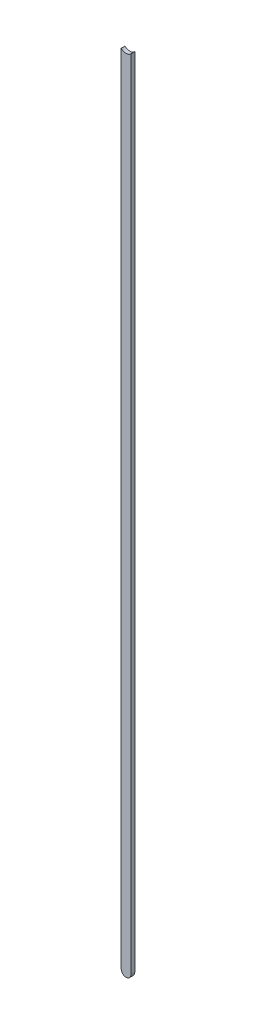
ISO-10303-21;
HEADER;
FILE_DESCRIPTION(('STEP AP214'),'2;1');
FILE_NAME('part.step','',(''),(''),'','','');
FILE_SCHEMA(('AUTOMOTIVE_DESIGN { 1 0 10303 214 1 1 1 1 }'));
ENDSEC;
DATA;
#1=APPLICATION_CONTEXT('core data for automotive mechanical design processes');
#2=APPLICATION_PROTOCOL_DEFINITION('international standard','automotive_design',2000,#1);
#3=PRODUCT_CONTEXT('',#1,'mechanical');
#4=PRODUCT('Part','Part','',(#3));
#5=PRODUCT_RELATED_PRODUCT_CATEGORY('part','',(#4));
#6=PRODUCT_DEFINITION_FORMATION('','',#4);
#7=PRODUCT_DEFINITION_CONTEXT('part definition',#1,'design');
#8=PRODUCT_DEFINITION('design','',#6,#7);
#9=PRODUCT_DEFINITION_SHAPE('','',#8);
#10=(LENGTH_UNIT() NAMED_UNIT(*) SI_UNIT(.MILLI.,.METRE.));
#11=(NAMED_UNIT(*) PLANE_ANGLE_UNIT() SI_UNIT($,.RADIAN.));
#12=(NAMED_UNIT(*) SI_UNIT($,.STERADIAN.) SOLID_ANGLE_UNIT());
#13=UNCERTAINTY_MEASURE_WITH_UNIT(LENGTH_MEASURE(1.E-05),#10,'distance_accuracy_value','');
#14=(GEOMETRIC_REPRESENTATION_CONTEXT(3) GLOBAL_UNCERTAINTY_ASSIGNED_CONTEXT((#13)) GLOBAL_UNIT_ASSIGNED_CONTEXT((#10,
#11,#12)) REPRESENTATION_CONTEXT('',''));
#15=CARTESIAN_POINT('',(0.,0.,0.));
#16=DIRECTION('',(0.,0.,1.));
#17=DIRECTION('',(1.,0.,0.));
#18=AXIS2_PLACEMENT_3D('',#15,#16,#17);
#19=CARTESIAN_POINT('',(117.3226,55.9816,0.));
#20=DIRECTION('',(-1.,0.,0.));
#21=DIRECTION('',(0.,1.,0.));
#22=AXIS2_PLACEMENT_3D('',#19,#20,#21);
#23=PLANE('',#22);
#24=DIRECTION('',(0.,1.,0.));
#25=VECTOR('',#24,1.);
#26=CARTESIAN_POINT('',(117.3226,55.9816,0.1999996));
#27=LINE('',#26,#25);
#28=CARTESIAN_POINT('',(117.3226,55.9816,0.1999996));
#29=VERTEX_POINT('',#28);
#30=CARTESIAN_POINT('',(117.3226,97.6862674421332,0.1999996));
#31=VERTEX_POINT('',#30);
#32=EDGE_CURVE('E11',#29,#31,#27,.T.);
#33=ORIENTED_EDGE('',*,*,#32,.F.);
#34=DIRECTION('',(0.,0.,1.));
#35=VECTOR('',#34,1.);
#36=CARTESIAN_POINT('',(117.3226,55.9816,0.));
#37=LINE('',#36,#35);
#38=CARTESIAN_POINT('',(117.3226,55.9816,0.));
#39=VERTEX_POINT('',#38);
#40=EDGE_CURVE('E24',#39,#29,#37,.T.);
#41=ORIENTED_EDGE('',*,*,#40,.F.);
#42=DIRECTION('',(0.,1.,0.));
#43=VECTOR('',#42,1.);
#44=CARTESIAN_POINT('',(117.3226,55.9816,0.));
#45=LINE('',#44,#43);
#46=CARTESIAN_POINT('',(117.3226,97.6862674421332,0.));
#47=VERTEX_POINT('',#46);
#48=EDGE_CURVE('E75',#39,#47,#45,.T.);
#49=ORIENTED_EDGE('',*,*,#48,.T.);
#50=DIRECTION('',(0.,0.,1.));
#51=VECTOR('',#50,1.);
#52=CARTESIAN_POINT('',(117.3226,97.6862674421332,0.));
#53=LINE('',#52,#51);
#54=EDGE_CURVE('E37',#47,#31,#53,.T.);
#55=ORIENTED_EDGE('',*,*,#54,.T.);
#56=EDGE_LOOP('',(#33,#41,#49,#55));
#57=FACE_BOUND('',#56,.T.);
#58=ADVANCED_FACE('F17',(#57),#23,.F.);
#59=CARTESIAN_POINT('',(117.0686,97.9351356,0.));
#60=DIRECTION('',(0.,0.,-1.));
#61=DIRECTION('',(1.,0.,0.));
#62=AXIS2_PLACEMENT_3D('',#59,#60,#61);
#63=CYLINDRICAL_SURFACE('',#62,0.3556);
#64=DIRECTION('',(0.,0.,1.));
#65=VECTOR('',#64,1.);
#66=CARTESIAN_POINT('',(116.8146,97.6862674421332,0.));
#67=LINE('',#66,#65);
#68=CARTESIAN_POINT('',(116.8146,97.6862674421332,0.));
#69=VERTEX_POINT('',#68);
#70=CARTESIAN_POINT('',(116.8146,97.6862674421332,0.1999996));
#71=VERTEX_POINT('',#70);
#72=EDGE_CURVE('E67',#69,#71,#67,.T.);
#73=ORIENTED_EDGE('',*,*,#72,.T.);
#74=CARTESIAN_POINT('',(117.0686,97.9351356,0.1999996));
#75=DIRECTION('',(0.,0.,1.));
#76=DIRECTION('',(1.,0.,0.));
#77=AXIS2_PLACEMENT_3D('',#74,#75,#76);
#78=CIRCLE('',#77,0.3556);
#79=EDGE_CURVE('E82',#71,#31,#78,.T.);
#80=ORIENTED_EDGE('',*,*,#79,.T.);
#81=ORIENTED_EDGE('',*,*,#54,.F.);
#82=CARTESIAN_POINT('',(117.0686,97.9351356,0.));
#83=DIRECTION('',(0.,0.,1.));
#84=DIRECTION('',(1.,0.,0.));
#85=AXIS2_PLACEMENT_3D('',#82,#83,#84);
#86=CIRCLE('',#85,0.3556);
#87=EDGE_CURVE('E80',#69,#47,#86,.T.);
#88=ORIENTED_EDGE('',*,*,#87,.F.);
#89=EDGE_LOOP('',(#73,#80,#81,#88));
#90=FACE_BOUND('',#89,.T.);
#91=ADVANCED_FACE('F88',(#90),#63,.F.);
#92=CARTESIAN_POINT('',(116.8146,97.6862674421332,0.));
#93=DIRECTION('',(1.,0.,0.));
#94=DIRECTION('',(0.,-1.,0.));
#95=AXIS2_PLACEMENT_3D('',#92,#93,#94);
#96=PLANE('',#95);
#97=DIRECTION('',(0.,-1.,0.));
#98=VECTOR('',#97,1.);
#99=CARTESIAN_POINT('',(116.8146,97.9351356,0.1999996));
#100=LINE('',#99,#98);
#101=CARTESIAN_POINT('',(116.8146,55.9816,0.1999996));
#102=VERTEX_POINT('',#101);
#103=EDGE_CURVE('E71',#71,#102,#100,.T.);
#104=ORIENTED_EDGE('',*,*,#103,.F.);
#105=ORIENTED_EDGE('',*,*,#72,.F.);
#106=DIRECTION('',(0.,-1.,0.));
#107=VECTOR('',#106,1.);
#108=CARTESIAN_POINT('',(116.8146,97.9351356,0.));
#109=LINE('',#108,#107);
#110=CARTESIAN_POINT('',(116.8146,55.9816,0.));
#111=VERTEX_POINT('',#110);
#112=EDGE_CURVE('E63',#69,#111,#109,.T.);
#113=ORIENTED_EDGE('',*,*,#112,.T.);
#114=DIRECTION('',(0.,0.,1.));
#115=VECTOR('',#114,1.);
#116=CARTESIAN_POINT('',(116.8146,55.9816,0.));
#117=LINE('',#116,#115);
#118=EDGE_CURVE('E53',#111,#102,#117,.T.);
#119=ORIENTED_EDGE('',*,*,#118,.T.);
#120=EDGE_LOOP('',(#104,#105,#113,#119));
#121=FACE_BOUND('',#120,.T.);
#122=ADVANCED_FACE('F66',(#121),#96,.F.);
#123=CARTESIAN_POINT('',(117.0686,55.9816,0.));
#124=DIRECTION('',(0.,0.,-1.));
#125=DIRECTION('',(-1.,0.,0.));
#126=AXIS2_PLACEMENT_3D('',#123,#124,#125);
#127=CYLINDRICAL_SURFACE('',#126,0.254);
#128=CARTESIAN_POINT('',(117.0686,55.9816,0.1999996));
#129=DIRECTION('',(0.,0.,1.));
#130=DIRECTION('',(-1.,0.,0.));
#131=AXIS2_PLACEMENT_3D('',#128,#129,#130);
#132=CIRCLE('',#131,0.254);
#133=EDGE_CURVE('E59',#102,#29,#132,.T.);
#134=ORIENTED_EDGE('',*,*,#133,.F.);
#135=ORIENTED_EDGE('',*,*,#118,.F.);
#136=CARTESIAN_POINT('',(117.0686,55.9816,0.));
#137=DIRECTION('',(0.,0.,1.));
#138=DIRECTION('',(-1.,0.,0.));
#139=AXIS2_PLACEMENT_3D('',#136,#137,#138);
#140=CIRCLE('',#139,0.254);
#141=EDGE_CURVE('E57',#111,#39,#140,.T.);
#142=ORIENTED_EDGE('',*,*,#141,.T.);
#143=ORIENTED_EDGE('',*,*,#40,.T.);
#144=EDGE_LOOP('',(#134,#135,#142,#143));
#145=FACE_BOUND('',#144,.T.);
#146=ADVANCED_FACE('F55',(#145),#127,.T.);
#147=CARTESIAN_POINT('',(117.3226,55.9816,0.));
#148=DIRECTION('',(0.,0.,-1.));
#149=DIRECTION('',(-1.,0.,0.));
#150=AXIS2_PLACEMENT_3D('',#147,#148,#149);
#151=PLANE('',#150);
#152=ORIENTED_EDGE('',*,*,#48,.F.);
#153=ORIENTED_EDGE('',*,*,#141,.F.);
#154=ORIENTED_EDGE('',*,*,#112,.F.);
#155=ORIENTED_EDGE('',*,*,#87,.T.);
#156=EDGE_LOOP('',(#152,#153,#154,#155));
#157=FACE_BOUND('',#156,.T.);
#158=ADVANCED_FACE('F74',(#157),#151,.T.);
#159=CARTESIAN_POINT('',(117.3226,55.9816,0.1999996));
#160=DIRECTION('',(0.,0.,-1.));
#161=DIRECTION('',(-1.,0.,0.));
#162=AXIS2_PLACEMENT_3D('',#159,#160,#161);
#163=PLANE('',#162);
#164=ORIENTED_EDGE('',*,*,#133,.T.);
#165=ORIENTED_EDGE('',*,*,#32,.T.);
#166=ORIENTED_EDGE('',*,*,#79,.F.);
#167=ORIENTED_EDGE('',*,*,#103,.T.);
#168=EDGE_LOOP('',(#164,#165,#166,#167));
#169=FACE_BOUND('',#168,.T.);
#170=ADVANCED_FACE('F91',(#169),#163,.F.);
#171=CLOSED_SHELL('',(#58,#91,#122,#146,#158,#170));
#172=MANIFOLD_SOLID_BREP('B1',#171);
#173=ADVANCED_BREP_SHAPE_REPRESENTATION('',(#18,#172),#14);
#174=SHAPE_DEFINITION_REPRESENTATION(#9,#173);
ENDSEC;
END-ISO-10303-21;
